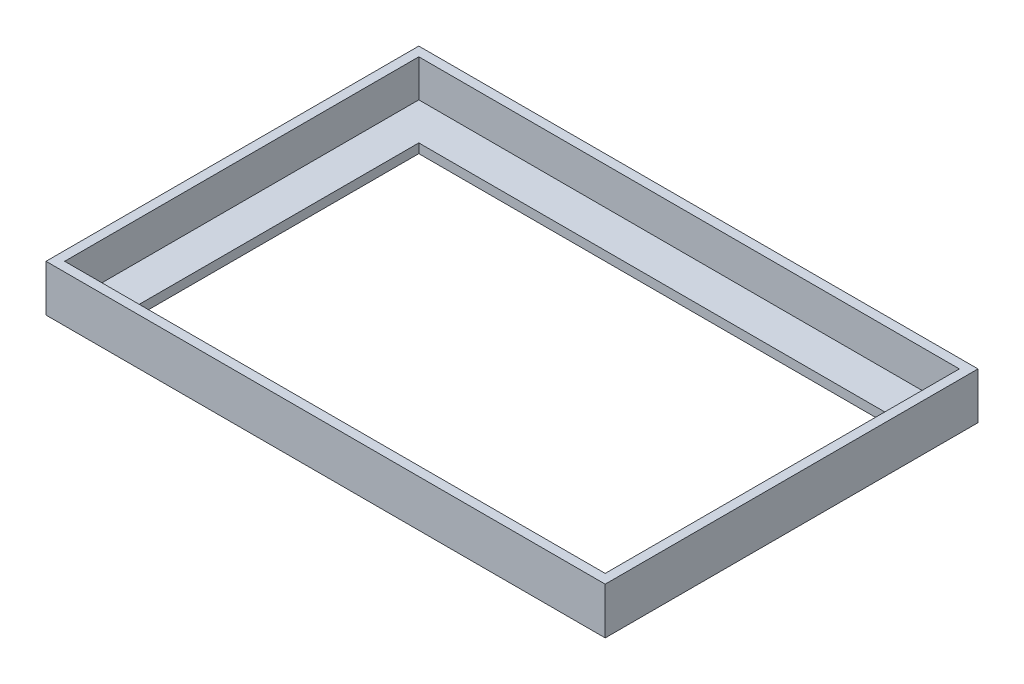
ISO-10303-21;
HEADER;
FILE_DESCRIPTION(('STEP AP214'),'2;1');
FILE_NAME('part.step','',(''),(''),'','','');
FILE_SCHEMA(('AUTOMOTIVE_DESIGN { 1 0 10303 214 1 1 1 1 }'));
ENDSEC;
DATA;
#1=APPLICATION_CONTEXT('core data for automotive mechanical design processes');
#2=APPLICATION_PROTOCOL_DEFINITION('international standard','automotive_design',2000,#1);
#3=PRODUCT_CONTEXT('',#1,'mechanical');
#4=PRODUCT('Part','Part','',(#3));
#5=PRODUCT_RELATED_PRODUCT_CATEGORY('part','',(#4));
#6=PRODUCT_DEFINITION_FORMATION('','',#4);
#7=PRODUCT_DEFINITION_CONTEXT('part definition',#1,'design');
#8=PRODUCT_DEFINITION('design','',#6,#7);
#9=PRODUCT_DEFINITION_SHAPE('','',#8);
#10=(LENGTH_UNIT() NAMED_UNIT(*) SI_UNIT(.MILLI.,.METRE.));
#11=(NAMED_UNIT(*) PLANE_ANGLE_UNIT() SI_UNIT($,.RADIAN.));
#12=(NAMED_UNIT(*) SI_UNIT($,.STERADIAN.) SOLID_ANGLE_UNIT());
#13=UNCERTAINTY_MEASURE_WITH_UNIT(LENGTH_MEASURE(1.E-05),#10,'distance_accuracy_value','');
#14=(GEOMETRIC_REPRESENTATION_CONTEXT(3) GLOBAL_UNCERTAINTY_ASSIGNED_CONTEXT((#13)) GLOBAL_UNIT_ASSIGNED_CONTEXT((#10,
#11,#12)) REPRESENTATION_CONTEXT('',''));
#15=CARTESIAN_POINT('',(0.,0.,0.));
#16=DIRECTION('',(0.,0.,1.));
#17=DIRECTION('',(1.,0.,0.));
#18=AXIS2_PLACEMENT_3D('',#15,#16,#17);
#19=CARTESIAN_POINT('',(1.00000000000001,5.,-1.));
#20=DIRECTION('',(0.,0.,-1.));
#21=DIRECTION('',(-1.,0.,0.));
#22=AXIS2_PLACEMENT_3D('',#19,#20,#21);
#23=PLANE('',#22);
#24=DIRECTION('',(0.,-1.,0.));
#25=VECTOR('',#24,1.);
#26=CARTESIAN_POINT('',(59.,5.,-1.));
#27=LINE('',#26,#25);
#28=CARTESIAN_POINT('',(59.,5.,-1.));
#29=VERTEX_POINT('',#28);
#30=CARTESIAN_POINT('',(59.,1.,-1.));
#31=VERTEX_POINT('',#30);
#32=EDGE_CURVE('E200',#29,#31,#27,.T.);
#33=ORIENTED_EDGE('',*,*,#32,.T.);
#34=DIRECTION('',(-1.,0.,0.));
#35=VECTOR('',#34,1.);
#36=CARTESIAN_POINT('',(1.00000000000001,1.,-1.));
#37=LINE('',#36,#35);
#38=CARTESIAN_POINT('',(1.00000000000001,1.,-1.));
#39=VERTEX_POINT('',#38);
#40=EDGE_CURVE('E170',#31,#39,#37,.T.);
#41=ORIENTED_EDGE('',*,*,#40,.T.);
#42=DIRECTION('',(0.,-1.,0.));
#43=VECTOR('',#42,1.);
#44=CARTESIAN_POINT('',(1.00000000000001,5.,-1.));
#45=LINE('',#44,#43);
#46=CARTESIAN_POINT('',(1.00000000000001,5.,-1.));
#47=VERTEX_POINT('',#46);
#48=EDGE_CURVE('E188',#47,#39,#45,.T.);
#49=ORIENTED_EDGE('',*,*,#48,.F.);
#50=DIRECTION('',(1.,0.,0.));
#51=VECTOR('',#50,1.);
#52=CARTESIAN_POINT('',(1.00000000000001,5.,-1.));
#53=LINE('',#52,#51);
#54=EDGE_CURVE('E174',#47,#29,#53,.T.);
#55=ORIENTED_EDGE('',*,*,#54,.T.);
#56=EDGE_LOOP('',(#33,#41,#49,#55));
#57=FACE_BOUND('',#56,.T.);
#58=ADVANCED_FACE('F45',(#57),#23,.T.);
#59=CARTESIAN_POINT('',(59.,5.,-39.));
#60=DIRECTION('',(1.,0.,0.));
#61=DIRECTION('',(0.,0.,-1.));
#62=AXIS2_PLACEMENT_3D('',#59,#60,#61);
#63=PLANE('',#62);
#64=DIRECTION('',(0.,0.,-1.));
#65=VECTOR('',#64,1.);
#66=CARTESIAN_POINT('',(59.,1.,-39.));
#67=LINE('',#66,#65);
#68=CARTESIAN_POINT('',(59.,1.,-39.));
#69=VERTEX_POINT('',#68);
#70=EDGE_CURVE('E167',#31,#69,#67,.T.);
#71=ORIENTED_EDGE('',*,*,#70,.F.);
#72=ORIENTED_EDGE('',*,*,#32,.F.);
#73=DIRECTION('',(0.,0.,1.));
#74=VECTOR('',#73,1.);
#75=CARTESIAN_POINT('',(59.,5.,-39.));
#76=LINE('',#75,#74);
#77=CARTESIAN_POINT('',(59.,5.,-39.));
#78=VERTEX_POINT('',#77);
#79=EDGE_CURVE('E177',#78,#29,#76,.T.);
#80=ORIENTED_EDGE('',*,*,#79,.F.);
#81=DIRECTION('',(0.,-1.,0.));
#82=VECTOR('',#81,1.);
#83=CARTESIAN_POINT('',(59.,5.,-39.));
#84=LINE('',#83,#82);
#85=EDGE_CURVE('E196',#78,#69,#84,.T.);
#86=ORIENTED_EDGE('',*,*,#85,.T.);
#87=EDGE_LOOP('',(#71,#72,#80,#86));
#88=FACE_BOUND('',#87,.T.);
#89=ADVANCED_FACE('F280',(#88),#63,.F.);
#90=CARTESIAN_POINT('',(1.,5.,-39.));
#91=DIRECTION('',(0.,0.,-1.));
#92=DIRECTION('',(-1.,0.,0.));
#93=AXIS2_PLACEMENT_3D('',#90,#91,#92);
#94=PLANE('',#93);
#95=DIRECTION('',(-1.,0.,0.));
#96=VECTOR('',#95,1.);
#97=CARTESIAN_POINT('',(1.,1.,-39.));
#98=LINE('',#97,#96);
#99=CARTESIAN_POINT('',(1.,1.,-39.));
#100=VERTEX_POINT('',#99);
#101=EDGE_CURVE('E164',#69,#100,#98,.T.);
#102=ORIENTED_EDGE('',*,*,#101,.F.);
#103=ORIENTED_EDGE('',*,*,#85,.F.);
#104=DIRECTION('',(1.,0.,0.));
#105=VECTOR('',#104,1.);
#106=CARTESIAN_POINT('',(1.,5.,-39.));
#107=LINE('',#106,#105);
#108=CARTESIAN_POINT('',(1.,5.,-39.));
#109=VERTEX_POINT('',#108);
#110=EDGE_CURVE('E181',#109,#78,#107,.T.);
#111=ORIENTED_EDGE('',*,*,#110,.F.);
#112=DIRECTION('',(0.,-1.,0.));
#113=VECTOR('',#112,1.);
#114=CARTESIAN_POINT('',(1.,5.,-39.));
#115=LINE('',#114,#113);
#116=EDGE_CURVE('E192',#109,#100,#115,.T.);
#117=ORIENTED_EDGE('',*,*,#116,.T.);
#118=EDGE_LOOP('',(#102,#103,#111,#117));
#119=FACE_BOUND('',#118,.T.);
#120=ADVANCED_FACE('F287',(#119),#94,.F.);
#121=CARTESIAN_POINT('',(1.,5.,-39.));
#122=DIRECTION('',(1.,0.,0.));
#123=DIRECTION('',(0.,0.,-1.));
#124=AXIS2_PLACEMENT_3D('',#121,#122,#123);
#125=PLANE('',#124);
#126=ORIENTED_EDGE('',*,*,#48,.T.);
#127=DIRECTION('',(0.,0.,-1.));
#128=VECTOR('',#127,1.);
#129=CARTESIAN_POINT('',(1.,1.,-39.));
#130=LINE('',#129,#128);
#131=EDGE_CURVE('E245',#39,#100,#130,.T.);
#132=ORIENTED_EDGE('',*,*,#131,.T.);
#133=ORIENTED_EDGE('',*,*,#116,.F.);
#134=DIRECTION('',(0.,0.,1.));
#135=VECTOR('',#134,1.);
#136=CARTESIAN_POINT('',(1.,5.,-39.));
#137=LINE('',#136,#135);
#138=EDGE_CURVE('E185',#109,#47,#137,.T.);
#139=ORIENTED_EDGE('',*,*,#138,.T.);
#140=EDGE_LOOP('',(#126,#132,#133,#139));
#141=FACE_BOUND('',#140,.T.);
#142=ADVANCED_FACE('F294',(#141),#125,.T.);
#143=CARTESIAN_POINT('',(0.,5.,0.));
#144=DIRECTION('',(0.,-1.,0.));
#145=DIRECTION('',(0.,0.,-1.));
#146=AXIS2_PLACEMENT_3D('',#143,#144,#145);
#147=PLANE('',#146);
#148=DIRECTION('',(0.,0.,1.));
#149=VECTOR('',#148,1.);
#150=CARTESIAN_POINT('',(0.,5.,0.));
#151=LINE('',#150,#149);
#152=CARTESIAN_POINT('',(0.,5.,-40.));
#153=VERTEX_POINT('',#152);
#154=CARTESIAN_POINT('',(0.,5.,0.));
#155=VERTEX_POINT('',#154);
#156=EDGE_CURVE('E205',#153,#155,#151,.T.);
#157=ORIENTED_EDGE('',*,*,#156,.T.);
#158=DIRECTION('',(1.,0.,0.));
#159=VECTOR('',#158,1.);
#160=CARTESIAN_POINT('',(0.,5.,0.));
#161=LINE('',#160,#159);
#162=CARTESIAN_POINT('',(60.,5.,0.));
#163=VERTEX_POINT('',#162);
#164=EDGE_CURVE('E209',#155,#163,#161,.T.);
#165=ORIENTED_EDGE('',*,*,#164,.T.);
#166=DIRECTION('',(0.,0.,-1.));
#167=VECTOR('',#166,1.);
#168=CARTESIAN_POINT('',(60.,5.,0.));
#169=LINE('',#168,#167);
#170=CARTESIAN_POINT('',(60.,5.,-40.));
#171=VERTEX_POINT('',#170);
#172=EDGE_CURVE('E213',#163,#171,#169,.T.);
#173=ORIENTED_EDGE('',*,*,#172,.T.);
#174=DIRECTION('',(-1.,0.,0.));
#175=VECTOR('',#174,1.);
#176=CARTESIAN_POINT('',(0.,5.,-40.));
#177=LINE('',#176,#175);
#178=EDGE_CURVE('E216',#171,#153,#177,.T.);
#179=ORIENTED_EDGE('',*,*,#178,.T.);
#180=EDGE_LOOP('',(#157,#165,#173,#179));
#181=FACE_BOUND('',#180,.T.);
#182=ORIENTED_EDGE('',*,*,#54,.F.);
#183=ORIENTED_EDGE('',*,*,#138,.F.);
#184=ORIENTED_EDGE('',*,*,#110,.T.);
#185=ORIENTED_EDGE('',*,*,#79,.T.);
#186=EDGE_LOOP('',(#182,#183,#184,#185));
#187=FACE_BOUND('',#186,.T.);
#188=ADVANCED_FACE('F292',(#181,#187),#147,.F.);
#189=CARTESIAN_POINT('',(0.,0.,0.));
#190=DIRECTION('',(0.,-1.,0.));
#191=DIRECTION('',(0.,0.,-1.));
#192=AXIS2_PLACEMENT_3D('',#189,#190,#191);
#193=PLANE('',#192);
#194=DIRECTION('',(0.,0.,-1.));
#195=VECTOR('',#194,1.);
#196=CARTESIAN_POINT('',(5.,0.,0.));
#197=LINE('',#196,#195);
#198=CARTESIAN_POINT('',(5.,0.,-5.));
#199=VERTEX_POINT('',#198);
#200=CARTESIAN_POINT('',(5.,0.,-35.));
#201=VERTEX_POINT('',#200);
#202=EDGE_CURVE('E158',#199,#201,#197,.T.);
#203=ORIENTED_EDGE('',*,*,#202,.F.);
#204=DIRECTION('',(-1.,0.,0.));
#205=VECTOR('',#204,1.);
#206=CARTESIAN_POINT('',(0.,0.,-5.));
#207=LINE('',#206,#205);
#208=CARTESIAN_POINT('',(55.,0.,-5.));
#209=VERTEX_POINT('',#208);
#210=EDGE_CURVE('E154',#209,#199,#207,.T.);
#211=ORIENTED_EDGE('',*,*,#210,.F.);
#212=DIRECTION('',(0.,0.,1.));
#213=VECTOR('',#212,1.);
#214=CARTESIAN_POINT('',(55.,0.,0.));
#215=LINE('',#214,#213);
#216=CARTESIAN_POINT('',(55.,0.,-35.));
#217=VERTEX_POINT('',#216);
#218=EDGE_CURVE('E138',#217,#209,#215,.T.);
#219=ORIENTED_EDGE('',*,*,#218,.F.);
#220=DIRECTION('',(1.,0.,0.));
#221=VECTOR('',#220,1.);
#222=CARTESIAN_POINT('',(0.,0.,-35.));
#223=LINE('',#222,#221);
#224=EDGE_CURVE('E132',#201,#217,#223,.T.);
#225=ORIENTED_EDGE('',*,*,#224,.F.);
#226=EDGE_LOOP('',(#203,#211,#219,#225));
#227=FACE_BOUND('',#226,.T.);
#228=DIRECTION('',(0.,0.,1.));
#229=VECTOR('',#228,1.);
#230=CARTESIAN_POINT('',(0.,0.,0.));
#231=LINE('',#230,#229);
#232=CARTESIAN_POINT('',(0.,0.,-40.));
#233=VERTEX_POINT('',#232);
#234=CARTESIAN_POINT('',(0.,0.,0.));
#235=VERTEX_POINT('',#234);
#236=EDGE_CURVE('E204',#233,#235,#231,.T.);
#237=ORIENTED_EDGE('',*,*,#236,.F.);
#238=DIRECTION('',(-1.,0.,0.));
#239=VECTOR('',#238,1.);
#240=CARTESIAN_POINT('',(0.,0.,-40.));
#241=LINE('',#240,#239);
#242=CARTESIAN_POINT('',(60.,0.,-40.));
#243=VERTEX_POINT('',#242);
#244=EDGE_CURVE('E210',#243,#233,#241,.T.);
#245=ORIENTED_EDGE('',*,*,#244,.F.);
#246=DIRECTION('',(0.,0.,-1.));
#247=VECTOR('',#246,1.);
#248=CARTESIAN_POINT('',(60.,0.,0.));
#249=LINE('',#248,#247);
#250=CARTESIAN_POINT('',(60.,0.,0.));
#251=VERTEX_POINT('',#250);
#252=EDGE_CURVE('E227',#251,#243,#249,.T.);
#253=ORIENTED_EDGE('',*,*,#252,.F.);
#254=DIRECTION('',(1.,0.,0.));
#255=VECTOR('',#254,1.);
#256=CARTESIAN_POINT('',(0.,0.,0.));
#257=LINE('',#256,#255);
#258=EDGE_CURVE('E223',#235,#251,#257,.T.);
#259=ORIENTED_EDGE('',*,*,#258,.F.);
#260=EDGE_LOOP('',(#237,#245,#253,#259));
#261=FACE_BOUND('',#260,.T.);
#262=ADVANCED_FACE('F152',(#227,#261),#193,.T.);
#263=CARTESIAN_POINT('',(0.,5.,0.));
#264=DIRECTION('',(1.,0.,0.));
#265=DIRECTION('',(0.,0.,-1.));
#266=AXIS2_PLACEMENT_3D('',#263,#264,#265);
#267=PLANE('',#266);
#268=ORIENTED_EDGE('',*,*,#236,.T.);
#269=DIRECTION('',(0.,-1.,0.));
#270=VECTOR('',#269,1.);
#271=CARTESIAN_POINT('',(0.,5.,0.));
#272=LINE('',#271,#270);
#273=EDGE_CURVE('E242',#155,#235,#272,.T.);
#274=ORIENTED_EDGE('',*,*,#273,.F.);
#275=ORIENTED_EDGE('',*,*,#156,.F.);
#276=DIRECTION('',(0.,-1.,0.));
#277=VECTOR('',#276,1.);
#278=CARTESIAN_POINT('',(0.,5.,-40.));
#279=LINE('',#278,#277);
#280=EDGE_CURVE('E219',#153,#233,#279,.T.);
#281=ORIENTED_EDGE('',*,*,#280,.T.);
#282=EDGE_LOOP('',(#268,#274,#275,#281));
#283=FACE_BOUND('',#282,.T.);
#284=ADVANCED_FACE('F47',(#283),#267,.F.);
#285=CARTESIAN_POINT('',(0.,5.,0.));
#286=DIRECTION('',(0.,0.,-1.));
#287=DIRECTION('',(-1.,0.,0.));
#288=AXIS2_PLACEMENT_3D('',#285,#286,#287);
#289=PLANE('',#288);
#290=ORIENTED_EDGE('',*,*,#258,.T.);
#291=DIRECTION('',(0.,-1.,0.));
#292=VECTOR('',#291,1.);
#293=CARTESIAN_POINT('',(60.,5.,0.));
#294=LINE('',#293,#292);
#295=EDGE_CURVE('E239',#163,#251,#294,.T.);
#296=ORIENTED_EDGE('',*,*,#295,.F.);
#297=ORIENTED_EDGE('',*,*,#164,.F.);
#298=ORIENTED_EDGE('',*,*,#273,.T.);
#299=EDGE_LOOP('',(#290,#296,#297,#298));
#300=FACE_BOUND('',#299,.T.);
#301=ADVANCED_FACE('F303',(#300),#289,.F.);
#302=CARTESIAN_POINT('',(60.,5.,0.));
#303=DIRECTION('',(-1.,0.,0.));
#304=DIRECTION('',(0.,0.,1.));
#305=AXIS2_PLACEMENT_3D('',#302,#303,#304);
#306=PLANE('',#305);
#307=ORIENTED_EDGE('',*,*,#252,.T.);
#308=DIRECTION('',(0.,-1.,0.));
#309=VECTOR('',#308,1.);
#310=CARTESIAN_POINT('',(60.,5.,-40.));
#311=LINE('',#310,#309);
#312=EDGE_CURVE('E236',#171,#243,#311,.T.);
#313=ORIENTED_EDGE('',*,*,#312,.F.);
#314=ORIENTED_EDGE('',*,*,#172,.F.);
#315=ORIENTED_EDGE('',*,*,#295,.T.);
#316=EDGE_LOOP('',(#307,#313,#314,#315));
#317=FACE_BOUND('',#316,.T.);
#318=ADVANCED_FACE('F300',(#317),#306,.F.);
#319=CARTESIAN_POINT('',(0.,5.,-40.));
#320=DIRECTION('',(0.,0.,1.));
#321=DIRECTION('',(1.,0.,0.));
#322=AXIS2_PLACEMENT_3D('',#319,#320,#321);
#323=PLANE('',#322);
#324=ORIENTED_EDGE('',*,*,#244,.T.);
#325=ORIENTED_EDGE('',*,*,#280,.F.);
#326=ORIENTED_EDGE('',*,*,#178,.F.);
#327=ORIENTED_EDGE('',*,*,#312,.T.);
#328=EDGE_LOOP('',(#324,#325,#326,#327));
#329=FACE_BOUND('',#328,.T.);
#330=ADVANCED_FACE('F276',(#329),#323,.F.);
#331=CARTESIAN_POINT('',(0.,1.,0.));
#332=DIRECTION('',(0.,-1.,0.));
#333=DIRECTION('',(0.,0.,-1.));
#334=AXIS2_PLACEMENT_3D('',#331,#332,#333);
#335=PLANE('',#334);
#336=DIRECTION('',(-1.,0.,0.));
#337=VECTOR('',#336,1.);
#338=CARTESIAN_POINT('',(0.,1.,-5.));
#339=LINE('',#338,#337);
#340=CARTESIAN_POINT('',(55.,1.,-5.));
#341=VERTEX_POINT('',#340);
#342=CARTESIAN_POINT('',(5.,1.,-5.));
#343=VERTEX_POINT('',#342);
#344=EDGE_CURVE('E54',#341,#343,#339,.T.);
#345=ORIENTED_EDGE('',*,*,#344,.T.);
#346=DIRECTION('',(0.,0.,-1.));
#347=VECTOR('',#346,1.);
#348=CARTESIAN_POINT('',(5.,1.,0.));
#349=LINE('',#348,#347);
#350=CARTESIAN_POINT('',(5.,1.,-35.));
#351=VERTEX_POINT('',#350);
#352=EDGE_CURVE('E11',#343,#351,#349,.T.);
#353=ORIENTED_EDGE('',*,*,#352,.T.);
#354=DIRECTION('',(1.,0.,0.));
#355=VECTOR('',#354,1.);
#356=CARTESIAN_POINT('',(0.,1.,-35.));
#357=LINE('',#356,#355);
#358=CARTESIAN_POINT('',(55.,1.,-35.));
#359=VERTEX_POINT('',#358);
#360=EDGE_CURVE('E249',#351,#359,#357,.T.);
#361=ORIENTED_EDGE('',*,*,#360,.T.);
#362=DIRECTION('',(0.,0.,1.));
#363=VECTOR('',#362,1.);
#364=CARTESIAN_POINT('',(55.,1.,0.));
#365=LINE('',#364,#363);
#366=EDGE_CURVE('E146',#359,#341,#365,.T.);
#367=ORIENTED_EDGE('',*,*,#366,.T.);
#368=EDGE_LOOP('',(#345,#353,#361,#367));
#369=FACE_BOUND('',#368,.T.);
#370=ORIENTED_EDGE('',*,*,#40,.F.);
#371=ORIENTED_EDGE('',*,*,#70,.T.);
#372=ORIENTED_EDGE('',*,*,#101,.T.);
#373=ORIENTED_EDGE('',*,*,#131,.F.);
#374=EDGE_LOOP('',(#370,#371,#372,#373));
#375=FACE_BOUND('',#374,.T.);
#376=ADVANCED_FACE('F256',(#369,#375),#335,.F.);
#377=CARTESIAN_POINT('',(5.,5.,-5.));
#378=DIRECTION('',(-1.,0.,0.));
#379=DIRECTION('',(0.,0.,1.));
#380=AXIS2_PLACEMENT_3D('',#377,#378,#379);
#381=PLANE('',#380);
#382=ORIENTED_EDGE('',*,*,#202,.T.);
#383=DIRECTION('',(0.,-1.,0.));
#384=VECTOR('',#383,1.);
#385=CARTESIAN_POINT('',(5.,5.,-35.));
#386=LINE('',#385,#384);
#387=EDGE_CURVE('E61',#351,#201,#386,.T.);
#388=ORIENTED_EDGE('',*,*,#387,.F.);
#389=ORIENTED_EDGE('',*,*,#352,.F.);
#390=DIRECTION('',(0.,-1.,0.));
#391=VECTOR('',#390,1.);
#392=CARTESIAN_POINT('',(5.,5.,-5.));
#393=LINE('',#392,#391);
#394=EDGE_CURVE('E139',#343,#199,#393,.T.);
#395=ORIENTED_EDGE('',*,*,#394,.T.);
#396=EDGE_LOOP('',(#382,#388,#389,#395));
#397=FACE_BOUND('',#396,.T.);
#398=ADVANCED_FACE('F268',(#397),#381,.F.);
#399=CARTESIAN_POINT('',(5.,5.,-5.));
#400=DIRECTION('',(0.,0.,1.));
#401=DIRECTION('',(1.,0.,0.));
#402=AXIS2_PLACEMENT_3D('',#399,#400,#401);
#403=PLANE('',#402);
#404=ORIENTED_EDGE('',*,*,#210,.T.);
#405=ORIENTED_EDGE('',*,*,#394,.F.);
#406=ORIENTED_EDGE('',*,*,#344,.F.);
#407=DIRECTION('',(0.,-1.,0.));
#408=VECTOR('',#407,1.);
#409=CARTESIAN_POINT('',(55.,5.,-5.));
#410=LINE('',#409,#408);
#411=EDGE_CURVE('E149',#341,#209,#410,.T.);
#412=ORIENTED_EDGE('',*,*,#411,.T.);
#413=EDGE_LOOP('',(#404,#405,#406,#412));
#414=FACE_BOUND('',#413,.T.);
#415=ADVANCED_FACE('F260',(#414),#403,.F.);
#416=CARTESIAN_POINT('',(55.,5.,-5.));
#417=DIRECTION('',(1.,0.,0.));
#418=DIRECTION('',(0.,0.,-1.));
#419=AXIS2_PLACEMENT_3D('',#416,#417,#418);
#420=PLANE('',#419);
#421=ORIENTED_EDGE('',*,*,#218,.T.);
#422=ORIENTED_EDGE('',*,*,#411,.F.);
#423=ORIENTED_EDGE('',*,*,#366,.F.);
#424=DIRECTION('',(0.,-1.,0.));
#425=VECTOR('',#424,1.);
#426=CARTESIAN_POINT('',(55.,5.,-35.));
#427=LINE('',#426,#425);
#428=EDGE_CURVE('E66',#359,#217,#427,.T.);
#429=ORIENTED_EDGE('',*,*,#428,.T.);
#430=EDGE_LOOP('',(#421,#422,#423,#429));
#431=FACE_BOUND('',#430,.T.);
#432=ADVANCED_FACE('F142',(#431),#420,.F.);
#433=CARTESIAN_POINT('',(5.,5.,-35.));
#434=DIRECTION('',(0.,0.,-1.));
#435=DIRECTION('',(-1.,0.,0.));
#436=AXIS2_PLACEMENT_3D('',#433,#434,#435);
#437=PLANE('',#436);
#438=ORIENTED_EDGE('',*,*,#224,.T.);
#439=ORIENTED_EDGE('',*,*,#428,.F.);
#440=ORIENTED_EDGE('',*,*,#360,.F.);
#441=ORIENTED_EDGE('',*,*,#387,.T.);
#442=EDGE_LOOP('',(#438,#439,#440,#441));
#443=FACE_BOUND('',#442,.T.);
#444=ADVANCED_FACE('F133',(#443),#437,.F.);
#445=CLOSED_SHELL('',(#58,#89,#120,#142,#188,#262,#284,#301,#318,#330,#376,#398,#415,#432,#444));
#446=MANIFOLD_SOLID_BREP('B2',#445);
#447=ADVANCED_BREP_SHAPE_REPRESENTATION('',(#18,#446),#14);
#448=SHAPE_DEFINITION_REPRESENTATION(#9,#447);
ENDSEC;
END-ISO-10303-21;
